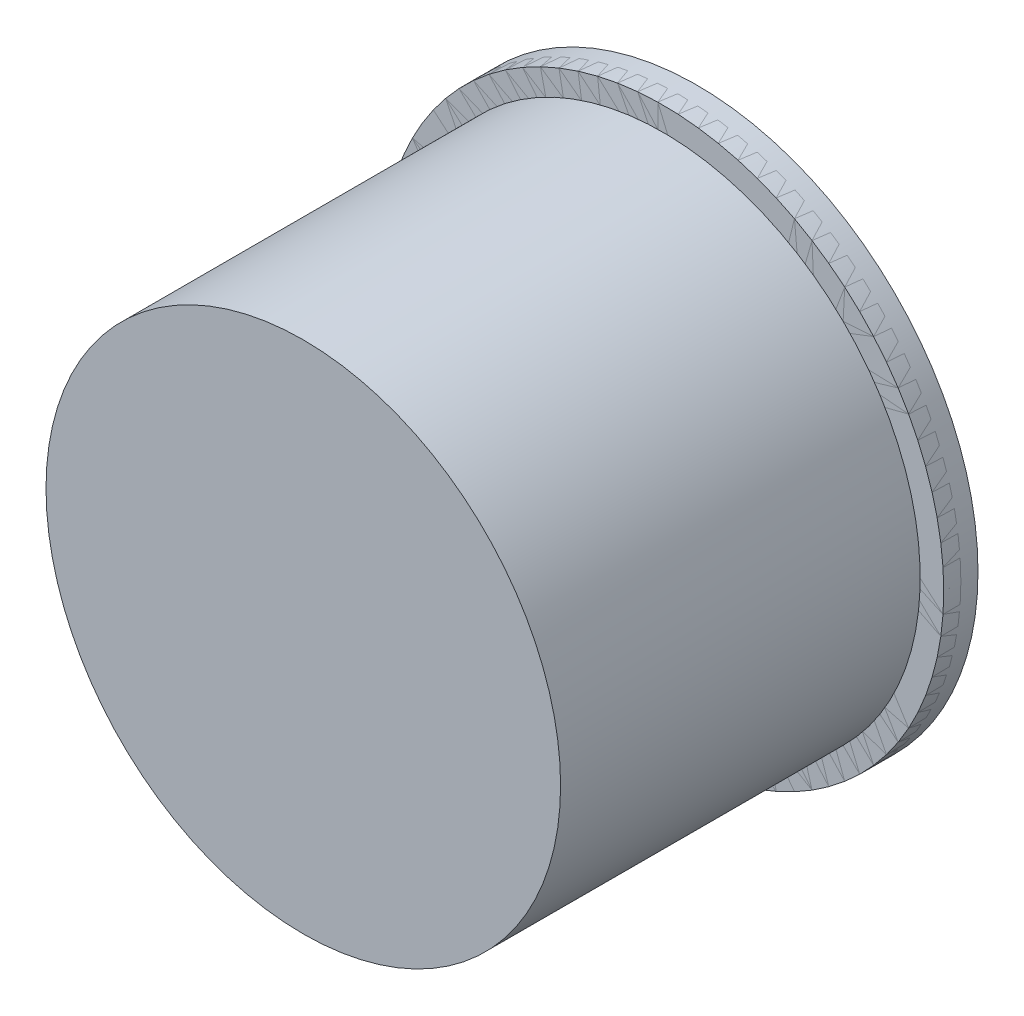
ISO-10303-21;
HEADER;
FILE_DESCRIPTION(('STEP AP214'),'2;1');
FILE_NAME('part.step','',(''),(''),'','','');
FILE_SCHEMA(('AUTOMOTIVE_DESIGN { 1 0 10303 214 1 1 1 1 }'));
ENDSEC;
DATA;
#1=APPLICATION_CONTEXT('core data for automotive mechanical design processes');
#2=APPLICATION_PROTOCOL_DEFINITION('international standard','automotive_design',2000,#1);
#3=PRODUCT_CONTEXT('',#1,'mechanical');
#4=PRODUCT('Part','Part','',(#3));
#5=PRODUCT_RELATED_PRODUCT_CATEGORY('part','',(#4));
#6=PRODUCT_DEFINITION_FORMATION('','',#4);
#7=PRODUCT_DEFINITION_CONTEXT('part definition',#1,'design');
#8=PRODUCT_DEFINITION('design','',#6,#7);
#9=PRODUCT_DEFINITION_SHAPE('','',#8);
#10=(LENGTH_UNIT() NAMED_UNIT(*) SI_UNIT(.MILLI.,.METRE.));
#11=(NAMED_UNIT(*) PLANE_ANGLE_UNIT() SI_UNIT($,.RADIAN.));
#12=(NAMED_UNIT(*) SI_UNIT($,.STERADIAN.) SOLID_ANGLE_UNIT());
#13=UNCERTAINTY_MEASURE_WITH_UNIT(LENGTH_MEASURE(1.E-05),#10,'distance_accuracy_value','');
#14=(GEOMETRIC_REPRESENTATION_CONTEXT(3) GLOBAL_UNCERTAINTY_ASSIGNED_CONTEXT((#13)) GLOBAL_UNIT_ASSIGNED_CONTEXT((#10,
#11,#12)) REPRESENTATION_CONTEXT('',''));
#15=CARTESIAN_POINT('',(0.,0.,0.));
#16=DIRECTION('',(0.,0.,1.));
#17=DIRECTION('',(1.,0.,0.));
#18=AXIS2_PLACEMENT_3D('',#15,#16,#17);
#19=CARTESIAN_POINT('',(0.,0.,16.5));
#20=DIRECTION('',(0.,0.,-1.));
#21=DIRECTION('',(-1.,0.,0.));
#22=AXIS2_PLACEMENT_3D('',#19,#20,#21);
#23=CYLINDRICAL_SURFACE('',#22,15.025);
#24=CARTESIAN_POINT('',(0.,0.,-6.5));
#25=DIRECTION('',(0.,0.,-1.));
#26=DIRECTION('',(-1.,0.,0.));
#27=AXIS2_PLACEMENT_3D('',#24,#25,#26);
#28=CIRCLE('',#27,15.025);
#29=CARTESIAN_POINT('',(-15.025,0.,-6.5));
#30=VERTEX_POINT('',#29);
#31=EDGE_CURVE('P0_E11',#30,#30,#28,.F.);
#32=ORIENTED_EDGE('',*,*,#31,.T.);
#33=EDGE_LOOP('',(#32));
#34=FACE_BOUND('',#33,.T.);
#35=CARTESIAN_POINT('',(0.,0.,14.5));
#36=DIRECTION('',(0.,0.,1.));
#37=DIRECTION('',(1.,0.,0.));
#38=AXIS2_PLACEMENT_3D('',#35,#36,#37);
#39=CIRCLE('',#38,15.025);
#40=CARTESIAN_POINT('',(15.025,0.,14.5));
#41=VERTEX_POINT('',#40);
#42=EDGE_CURVE('P0_E80',#41,#41,#39,.T.);
#43=ORIENTED_EDGE('',*,*,#42,.F.);
#44=EDGE_LOOP('',(#43));
#45=FACE_BOUND('',#44,.T.);
#46=ADVANCED_FACE('P0_F46',(#34,#45),#23,.T.);
#47=CARTESIAN_POINT('',(0.,0.,-8.5));
#48=DIRECTION('',(0.,0.,1.));
#49=DIRECTION('',(1.,0.,0.));
#50=AXIS2_PLACEMENT_3D('',#47,#48,#49);
#51=CYLINDRICAL_SURFACE('',#50,16.4);
#52=CARTESIAN_POINT('',(0.,0.,-6.5));
#53=DIRECTION('',(0.,0.,-1.));
#54=DIRECTION('',(1.,0.,0.));
#55=AXIS2_PLACEMENT_3D('',#52,#53,#54);
#56=CIRCLE('',#55,16.4);
#57=CARTESIAN_POINT('',(16.4,0.,-6.5));
#58=VERTEX_POINT('',#57);
#59=EDGE_CURVE('P0_E62',#58,#58,#56,.T.);
#60=ORIENTED_EDGE('',*,*,#59,.T.);
#61=EDGE_LOOP('',(#60));
#62=FACE_BOUND('',#61,.T.);
#63=CARTESIAN_POINT('',(0.,0.,-7.5));
#64=DIRECTION('',(0.,0.,-1.));
#65=DIRECTION('',(-1.,0.,0.));
#66=AXIS2_PLACEMENT_3D('',#63,#64,#65);
#67=CIRCLE('',#66,16.4);
#68=CARTESIAN_POINT('',(-16.4,0.,-7.5));
#69=VERTEX_POINT('',#68);
#70=EDGE_CURVE('P0_E67',#69,#69,#67,.T.);
#71=ORIENTED_EDGE('',*,*,#70,.F.);
#72=EDGE_LOOP('',(#71));
#73=FACE_BOUND('',#72,.T.);
#74=ADVANCED_FACE('P0_F63',(#62,#73),#51,.T.);
#75=CARTESIAN_POINT('',(0.,0.,-6.5));
#76=DIRECTION('',(0.,0.,-1.));
#77=DIRECTION('',(0.,-1.,0.));
#78=AXIS2_PLACEMENT_3D('',#75,#76,#77);
#79=PLANE('',#78);
#80=ORIENTED_EDGE('',*,*,#31,.F.);
#81=EDGE_LOOP('',(#80));
#82=FACE_BOUND('',#81,.T.);
#83=ORIENTED_EDGE('',*,*,#59,.F.);
#84=EDGE_LOOP('',(#83));
#85=FACE_BOUND('',#84,.T.);
#86=ADVANCED_FACE('P0_F48',(#82,#85),#79,.F.);
#87=CARTESIAN_POINT('',(0.,0.,-7.5));
#88=DIRECTION('',(0.,0.,-1.));
#89=DIRECTION('',(-1.,0.,0.));
#90=AXIS2_PLACEMENT_3D('',#87,#88,#89);
#91=PLANE('',#90);
#92=CARTESIAN_POINT('',(0.,0.,-7.5));
#93=DIRECTION('',(0.,0.,-1.));
#94=DIRECTION('',(-1.,0.,0.));
#95=AXIS2_PLACEMENT_3D('',#92,#93,#94);
#96=CIRCLE('',#95,6.05);
#97=CARTESIAN_POINT('',(-6.05,0.,-7.5));
#98=VERTEX_POINT('',#97);
#99=EDGE_CURVE('P0_E54',#98,#98,#96,.T.);
#100=ORIENTED_EDGE('',*,*,#99,.F.);
#101=EDGE_LOOP('',(#100));
#102=FACE_BOUND('',#101,.T.);
#103=ORIENTED_EDGE('',*,*,#70,.T.);
#104=EDGE_LOOP('',(#103));
#105=FACE_BOUND('',#104,.T.);
#106=ADVANCED_FACE('P0_F102',(#102,#105),#91,.T.);
#107=CARTESIAN_POINT('',(0.,0.,-13.));
#108=DIRECTION('',(0.,0.,1.));
#109=DIRECTION('',(1.,0.,0.));
#110=AXIS2_PLACEMENT_3D('',#107,#108,#109);
#111=CYLINDRICAL_SURFACE('',#110,6.05);
#112=CARTESIAN_POINT('',(0.,0.,-13.));
#113=DIRECTION('',(0.,0.,-1.));
#114=DIRECTION('',(-1.,0.,0.));
#115=AXIS2_PLACEMENT_3D('',#112,#113,#114);
#116=CIRCLE('',#115,6.05);
#117=CARTESIAN_POINT('',(-6.05,0.,-13.));
#118=VERTEX_POINT('',#117);
#119=EDGE_CURVE('P0_E74',#118,#118,#116,.T.);
#120=ORIENTED_EDGE('',*,*,#119,.F.);
#121=EDGE_LOOP('',(#120));
#122=FACE_BOUND('',#121,.T.);
#123=ORIENTED_EDGE('',*,*,#99,.T.);
#124=EDGE_LOOP('',(#123));
#125=FACE_BOUND('',#124,.T.);
#126=ADVANCED_FACE('P0_F98',(#122,#125),#111,.T.);
#127=CARTESIAN_POINT('',(0.,0.,-13.));
#128=DIRECTION('',(0.,0.,-1.));
#129=DIRECTION('',(-1.,0.,0.));
#130=AXIS2_PLACEMENT_3D('',#127,#128,#129);
#131=PLANE('',#130);
#132=ORIENTED_EDGE('',*,*,#119,.T.);
#133=EDGE_LOOP('',(#132));
#134=FACE_BOUND('',#133,.T.);
#135=ADVANCED_FACE('P0_F95',(#134),#131,.T.);
#136=CARTESIAN_POINT('',(0.,0.,14.5));
#137=DIRECTION('',(0.,0.,1.));
#138=DIRECTION('',(1.,0.,0.));
#139=AXIS2_PLACEMENT_3D('',#136,#137,#138);
#140=PLANE('',#139);
#141=ORIENTED_EDGE('',*,*,#42,.T.);
#142=EDGE_LOOP('',(#141));
#143=FACE_BOUND('',#142,.T.);
#144=ADVANCED_FACE('P0_F85',(#143),#140,.T.);
#145=CLOSED_SHELL('',(#46,#74,#86,#106,#126,#135,#144));
#146=MANIFOLD_SOLID_BREP('P0_B2',#145);
#147=CARTESIAN_POINT('',(0.,13.5,8.5));
#148=DIRECTION('',(0.,0.,1.));
#149=DIRECTION('',(1.,0.,0.));
#150=AXIS2_PLACEMENT_3D('',#147,#148,#149);
#151=CONICAL_SURFACE('',#150,1.25,0.785398162500002);
#152=CARTESIAN_POINT('',(0.,13.5,8.5));
#153=DIRECTION('',(0.,0.,-1.));
#154=DIRECTION('',(1.,0.,0.));
#155=AXIS2_PLACEMENT_3D('',#152,#153,#154);
#156=CIRCLE('',#155,1.25);
#157=CARTESIAN_POINT('',(1.25000000000005,13.5,8.5));
#158=VERTEX_POINT('',#157);
#159=EDGE_CURVE('P1_E19',#158,#158,#156,.T.);
#160=ORIENTED_EDGE('',*,*,#159,.F.);
#161=EDGE_LOOP('',(#160));
#162=FACE_BOUND('',#161,.T.);
#163=CARTESIAN_POINT('',(0.,13.5,8.275));
#164=DIRECTION('',(0.,0.,1.));
#165=DIRECTION('',(1.,0.,0.));
#166=AXIS2_PLACEMENT_3D('',#163,#164,#165);
#167=CIRCLE('',#166,1.025);
#168=CARTESIAN_POINT('',(1.02500000000005,13.5,8.275));
#169=VERTEX_POINT('',#168);
#170=EDGE_CURVE('P1_E10',#169,#169,#167,.T.);
#171=ORIENTED_EDGE('',*,*,#170,.F.);
#172=EDGE_LOOP('',(#171));
#173=FACE_BOUND('',#172,.T.);
#174=ADVANCED_FACE('P1_F15',(#162,#173),#151,.F.);
#175=CARTESIAN_POINT('',(0.,13.5,8.5));
#176=DIRECTION('',(0.,0.,-1.));
#177=DIRECTION('',(-1.,0.,0.));
#178=AXIS2_PLACEMENT_3D('',#175,#176,#177);
#179=CYLINDRICAL_SURFACE('',#178,1.025);
#180=CARTESIAN_POINT('',(0.,13.5,3.5));
#181=DIRECTION('',(0.,0.,1.));
#182=DIRECTION('',(-1.,0.,0.));
#183=AXIS2_PLACEMENT_3D('',#180,#181,#182);
#184=CIRCLE('',#183,1.025);
#185=CARTESIAN_POINT('',(-1.02499999999995,13.5,3.5));
#186=VERTEX_POINT('',#185);
#187=EDGE_CURVE('P1_E26',#186,#186,#184,.T.);
#188=ORIENTED_EDGE('',*,*,#187,.F.);
#189=EDGE_LOOP('',(#188));
#190=FACE_BOUND('',#189,.T.);
#191=ORIENTED_EDGE('',*,*,#170,.T.);
#192=EDGE_LOOP('',(#191));
#193=FACE_BOUND('',#192,.T.);
#194=ADVANCED_FACE('P1_F211',(#190,#193),#179,.F.);
#195=CARTESIAN_POINT('',(0.,13.5,3.5));
#196=DIRECTION('',(0.,0.,1.));
#197=DIRECTION('',(1.,0.,0.));
#198=AXIS2_PLACEMENT_3D('',#195,#196,#197);
#199=CONICAL_SURFACE('',#198,1.025,1.0297442575);
#200=CARTESIAN_POINT('',(0.,13.5,2.88411786549675));
#201=VERTEX_POINT('',#200);
#202=VERTEX_LOOP('',#201);
#203=FACE_BOUND('',#202,.T.);
#204=ORIENTED_EDGE('',*,*,#187,.T.);
#205=EDGE_LOOP('',(#204));
#206=FACE_BOUND('',#205,.T.);
#207=ADVANCED_FACE('P1_F217',(#203,#206),#199,.F.);
#208=CARTESIAN_POINT('',(13.5,0.,8.5));
#209=DIRECTION('',(0.,0.,1.));
#210=DIRECTION('',(1.,0.,0.));
#211=AXIS2_PLACEMENT_3D('',#208,#209,#210);
#212=CONICAL_SURFACE('',#211,1.25,0.7853981625);
#213=CARTESIAN_POINT('',(13.5,0.,8.5));
#214=DIRECTION('',(0.,0.,-1.));
#215=DIRECTION('',(1.,0.,0.));
#216=AXIS2_PLACEMENT_3D('',#213,#214,#215);
#217=CIRCLE('',#216,1.25);
#218=CARTESIAN_POINT('',(14.75,0.,8.5));
#219=VERTEX_POINT('',#218);
#220=EDGE_CURVE('P1_E166',#219,#219,#217,.T.);
#221=ORIENTED_EDGE('',*,*,#220,.F.);
#222=EDGE_LOOP('',(#221));
#223=FACE_BOUND('',#222,.T.);
#224=CARTESIAN_POINT('',(13.5,0.,8.275));
#225=DIRECTION('',(0.,0.,1.));
#226=DIRECTION('',(1.,0.,0.));
#227=AXIS2_PLACEMENT_3D('',#224,#225,#226);
#228=CIRCLE('',#227,1.025);
#229=CARTESIAN_POINT('',(14.525,0.,8.275));
#230=VERTEX_POINT('',#229);
#231=EDGE_CURVE('P1_E120',#230,#230,#228,.T.);
#232=ORIENTED_EDGE('',*,*,#231,.F.);
#233=EDGE_LOOP('',(#232));
#234=FACE_BOUND('',#233,.T.);
#235=ADVANCED_FACE('P1_F222',(#223,#234),#212,.F.);
#236=CARTESIAN_POINT('',(13.5,0.,8.5));
#237=DIRECTION('',(0.,0.,-1.));
#238=DIRECTION('',(-1.,0.,0.));
#239=AXIS2_PLACEMENT_3D('',#236,#237,#238);
#240=CYLINDRICAL_SURFACE('',#239,1.025);
#241=CARTESIAN_POINT('',(13.5,0.,3.5));
#242=DIRECTION('',(0.,0.,1.));
#243=DIRECTION('',(-1.,0.,0.));
#244=AXIS2_PLACEMENT_3D('',#241,#242,#243);
#245=CIRCLE('',#244,1.025);
#246=CARTESIAN_POINT('',(12.475,0.,3.5));
#247=VERTEX_POINT('',#246);
#248=EDGE_CURVE('P1_E124',#247,#247,#245,.T.);
#249=ORIENTED_EDGE('',*,*,#248,.F.);
#250=EDGE_LOOP('',(#249));
#251=FACE_BOUND('',#250,.T.);
#252=ORIENTED_EDGE('',*,*,#231,.T.);
#253=EDGE_LOOP('',(#252));
#254=FACE_BOUND('',#253,.T.);
#255=ADVANCED_FACE('P1_F121',(#251,#254),#240,.F.);
#256=CARTESIAN_POINT('',(13.5,0.,3.5));
#257=DIRECTION('',(0.,0.,1.));
#258=DIRECTION('',(1.,0.,0.));
#259=AXIS2_PLACEMENT_3D('',#256,#257,#258);
#260=CONICAL_SURFACE('',#259,1.025,1.0297442575);
#261=CARTESIAN_POINT('',(13.5,0.,2.88411786549675));
#262=VERTEX_POINT('',#261);
#263=VERTEX_LOOP('',#262);
#264=FACE_BOUND('',#263,.T.);
#265=ORIENTED_EDGE('',*,*,#248,.T.);
#266=EDGE_LOOP('',(#265));
#267=FACE_BOUND('',#266,.T.);
#268=ADVANCED_FACE('P1_F17',(#264,#267),#260,.F.);
#269=CARTESIAN_POINT('',(0.,-13.5,8.5));
#270=DIRECTION('',(0.,0.,1.));
#271=DIRECTION('',(1.,0.,0.));
#272=AXIS2_PLACEMENT_3D('',#269,#270,#271);
#273=CONICAL_SURFACE('',#272,1.25,0.785398162500002);
#274=CARTESIAN_POINT('',(0.,-13.5,8.5));
#275=DIRECTION('',(0.,0.,-1.));
#276=DIRECTION('',(1.,0.,0.));
#277=AXIS2_PLACEMENT_3D('',#274,#275,#276);
#278=CIRCLE('',#277,1.25);
#279=CARTESIAN_POINT('',(1.24999999999998,-13.5,8.5));
#280=VERTEX_POINT('',#279);
#281=EDGE_CURVE('P1_E164',#280,#280,#278,.T.);
#282=ORIENTED_EDGE('',*,*,#281,.F.);
#283=EDGE_LOOP('',(#282));
#284=FACE_BOUND('',#283,.T.);
#285=CARTESIAN_POINT('',(0.,-13.5,8.275));
#286=DIRECTION('',(0.,0.,1.));
#287=DIRECTION('',(1.,0.,0.));
#288=AXIS2_PLACEMENT_3D('',#285,#286,#287);
#289=CIRCLE('',#288,1.025);
#290=CARTESIAN_POINT('',(1.02499999999998,-13.5,8.275));
#291=VERTEX_POINT('',#290);
#292=EDGE_CURVE('P1_E132',#291,#291,#289,.T.);
#293=ORIENTED_EDGE('',*,*,#292,.F.);
#294=EDGE_LOOP('',(#293));
#295=FACE_BOUND('',#294,.T.);
#296=ADVANCED_FACE('P1_F240',(#284,#295),#273,.F.);
#297=CARTESIAN_POINT('',(0.,-13.5,8.5));
#298=DIRECTION('',(0.,0.,-1.));
#299=DIRECTION('',(-1.,0.,0.));
#300=AXIS2_PLACEMENT_3D('',#297,#298,#299);
#301=CYLINDRICAL_SURFACE('',#300,1.025);
#302=CARTESIAN_POINT('',(0.,-13.5,3.5));
#303=DIRECTION('',(0.,0.,1.));
#304=DIRECTION('',(-1.,0.,0.));
#305=AXIS2_PLACEMENT_3D('',#302,#303,#304);
#306=CIRCLE('',#305,1.025);
#307=CARTESIAN_POINT('',(-1.02500000000002,-13.5,3.5));
#308=VERTEX_POINT('',#307);
#309=EDGE_CURVE('P1_E160',#308,#308,#306,.T.);
#310=ORIENTED_EDGE('',*,*,#309,.F.);
#311=EDGE_LOOP('',(#310));
#312=FACE_BOUND('',#311,.T.);
#313=ORIENTED_EDGE('',*,*,#292,.T.);
#314=EDGE_LOOP('',(#313));
#315=FACE_BOUND('',#314,.T.);
#316=ADVANCED_FACE('P1_F236',(#312,#315),#301,.F.);
#317=CARTESIAN_POINT('',(0.,-13.5,3.5));
#318=DIRECTION('',(0.,0.,1.));
#319=DIRECTION('',(1.,0.,0.));
#320=AXIS2_PLACEMENT_3D('',#317,#318,#319);
#321=CONICAL_SURFACE('',#320,1.025,1.0297442575);
#322=CARTESIAN_POINT('',(0.,-13.5,2.88411786549675));
#323=VERTEX_POINT('',#322);
#324=VERTEX_LOOP('',#323);
#325=FACE_BOUND('',#324,.T.);
#326=ORIENTED_EDGE('',*,*,#309,.T.);
#327=EDGE_LOOP('',(#326));
#328=FACE_BOUND('',#327,.T.);
#329=ADVANCED_FACE('P1_F239',(#325,#328),#321,.F.);
#330=CARTESIAN_POINT('',(-13.5,0.,8.5));
#331=DIRECTION('',(0.,0.,1.));
#332=DIRECTION('',(1.,0.,0.));
#333=AXIS2_PLACEMENT_3D('',#330,#331,#332);
#334=CONICAL_SURFACE('',#333,1.25,0.7853981625);
#335=CARTESIAN_POINT('',(-13.5,0.,8.5));
#336=DIRECTION('',(0.,0.,-1.));
#337=DIRECTION('',(1.,0.,0.));
#338=AXIS2_PLACEMENT_3D('',#335,#336,#337);
#339=CIRCLE('',#338,1.25);
#340=CARTESIAN_POINT('',(-12.25,0.,8.5));
#341=VERTEX_POINT('',#340);
#342=EDGE_CURVE('P1_E156',#341,#341,#339,.T.);
#343=ORIENTED_EDGE('',*,*,#342,.F.);
#344=EDGE_LOOP('',(#343));
#345=FACE_BOUND('',#344,.T.);
#346=CARTESIAN_POINT('',(-13.5,0.,8.275));
#347=DIRECTION('',(0.,0.,1.));
#348=DIRECTION('',(1.,0.,0.));
#349=AXIS2_PLACEMENT_3D('',#346,#347,#348);
#350=CIRCLE('',#349,1.025);
#351=CARTESIAN_POINT('',(-12.475,0.,8.275));
#352=VERTEX_POINT('',#351);
#353=EDGE_CURVE('P1_E161',#352,#352,#350,.T.);
#354=ORIENTED_EDGE('',*,*,#353,.F.);
#355=EDGE_LOOP('',(#354));
#356=FACE_BOUND('',#355,.T.);
#357=ADVANCED_FACE('P1_F321',(#345,#356),#334,.F.);
#358=CARTESIAN_POINT('',(-13.5,0.,8.5));
#359=DIRECTION('',(0.,0.,-1.));
#360=DIRECTION('',(-1.,0.,0.));
#361=AXIS2_PLACEMENT_3D('',#358,#359,#360);
#362=CYLINDRICAL_SURFACE('',#361,1.025);
#363=CARTESIAN_POINT('',(-13.5,0.,3.5));
#364=DIRECTION('',(0.,0.,1.));
#365=DIRECTION('',(-1.,0.,0.));
#366=AXIS2_PLACEMENT_3D('',#363,#364,#365);
#367=CIRCLE('',#366,1.025);
#368=CARTESIAN_POINT('',(-14.525,0.,3.5));
#369=VERTEX_POINT('',#368);
#370=EDGE_CURVE('P1_E163',#369,#369,#367,.T.);
#371=ORIENTED_EDGE('',*,*,#370,.F.);
#372=EDGE_LOOP('',(#371));
#373=FACE_BOUND('',#372,.T.);
#374=ORIENTED_EDGE('',*,*,#353,.T.);
#375=EDGE_LOOP('',(#374));
#376=FACE_BOUND('',#375,.T.);
#377=ADVANCED_FACE('P1_F329',(#373,#376),#362,.F.);
#378=CARTESIAN_POINT('',(-13.5,0.,3.5));
#379=DIRECTION('',(0.,0.,1.));
#380=DIRECTION('',(1.,0.,0.));
#381=AXIS2_PLACEMENT_3D('',#378,#379,#380);
#382=CONICAL_SURFACE('',#381,1.025,1.0297442575);
#383=CARTESIAN_POINT('',(-13.5,0.,2.88411786549675));
#384=VERTEX_POINT('',#383);
#385=VERTEX_LOOP('',#384);
#386=FACE_BOUND('',#385,.T.);
#387=ORIENTED_EDGE('',*,*,#370,.T.);
#388=EDGE_LOOP('',(#387));
#389=FACE_BOUND('',#388,.T.);
#390=ADVANCED_FACE('P1_F261',(#386,#389),#382,.F.);
#391=CARTESIAN_POINT('',(0.,0.,-2.5));
#392=DIRECTION('',(0.,0.,-1.));
#393=DIRECTION('',(-1.,0.,0.));
#394=AXIS2_PLACEMENT_3D('',#391,#392,#393);
#395=CYLINDRICAL_SURFACE('',#394,12.);
#396=CARTESIAN_POINT('',(0.,0.,-8.5));
#397=DIRECTION('',(0.,0.,-1.));
#398=DIRECTION('',(1.,0.,0.));
#399=AXIS2_PLACEMENT_3D('',#396,#397,#398);
#400=CIRCLE('',#399,12.);
#401=CARTESIAN_POINT('',(12.,0.,-8.5));
#402=VERTEX_POINT('',#401);
#403=EDGE_CURVE('P1_E138',#402,#402,#400,.T.);
#404=ORIENTED_EDGE('',*,*,#403,.T.);
#405=EDGE_LOOP('',(#404));
#406=FACE_BOUND('',#405,.T.);
#407=CARTESIAN_POINT('',(0.,0.,-2.5));
#408=DIRECTION('',(0.,0.,1.));
#409=DIRECTION('',(1.,0.,0.));
#410=AXIS2_PLACEMENT_3D('',#407,#408,#409);
#411=CIRCLE('',#410,12.);
#412=CARTESIAN_POINT('',(12.,0.,-2.5));
#413=VERTEX_POINT('',#412);
#414=EDGE_CURVE('P1_E264',#413,#413,#411,.T.);
#415=ORIENTED_EDGE('',*,*,#414,.T.);
#416=EDGE_LOOP('',(#415));
#417=FACE_BOUND('',#416,.T.);
#418=ADVANCED_FACE('P1_F258',(#406,#417),#395,.F.);
#419=CARTESIAN_POINT('',(0.,0.,-2.5));
#420=DIRECTION('',(0.,0.,-1.));
#421=DIRECTION('',(0.,-1.,0.));
#422=AXIS2_PLACEMENT_3D('',#419,#420,#421);
#423=PLANE('',#422);
#424=CARTESIAN_POINT('',(0.,0.,-2.5));
#425=DIRECTION('',(0.,0.,1.));
#426=DIRECTION('',(-1.,0.,0.));
#427=AXIS2_PLACEMENT_3D('',#424,#425,#426);
#428=CIRCLE('',#427,11.);
#429=CARTESIAN_POINT('',(-11.,0.,-2.5));
#430=VERTEX_POINT('',#429);
#431=EDGE_CURVE('P1_E176',#430,#430,#428,.T.);
#432=ORIENTED_EDGE('',*,*,#431,.T.);
#433=EDGE_LOOP('',(#432));
#434=FACE_BOUND('',#433,.T.);
#435=ORIENTED_EDGE('',*,*,#414,.F.);
#436=EDGE_LOOP('',(#435));
#437=FACE_BOUND('',#436,.T.);
#438=ADVANCED_FACE('P1_F231',(#434,#437),#423,.T.);
#439=CARTESIAN_POINT('',(0.,0.,2.5));
#440=DIRECTION('',(0.,0.,1.));
#441=DIRECTION('',(1.,0.,0.));
#442=AXIS2_PLACEMENT_3D('',#439,#440,#441);
#443=CYLINDRICAL_SURFACE('',#442,12.);
#444=CARTESIAN_POINT('',(0.,0.,8.5));
#445=DIRECTION('',(0.,0.,1.));
#446=DIRECTION('',(1.,0.,0.));
#447=AXIS2_PLACEMENT_3D('',#444,#445,#446);
#448=CIRCLE('',#447,12.);
#449=CARTESIAN_POINT('',(12.,0.,8.5));
#450=VERTEX_POINT('',#449);
#451=EDGE_CURVE('P1_E148',#450,#450,#448,.T.);
#452=ORIENTED_EDGE('',*,*,#451,.T.);
#453=EDGE_LOOP('',(#452));
#454=FACE_BOUND('',#453,.T.);
#455=CARTESIAN_POINT('',(0.,0.,2.5));
#456=DIRECTION('',(0.,0.,-1.));
#457=DIRECTION('',(1.,0.,0.));
#458=AXIS2_PLACEMENT_3D('',#455,#456,#457);
#459=CIRCLE('',#458,12.);
#460=CARTESIAN_POINT('',(12.,0.,2.5));
#461=VERTEX_POINT('',#460);
#462=EDGE_CURVE('P1_E145',#461,#461,#459,.T.);
#463=ORIENTED_EDGE('',*,*,#462,.T.);
#464=EDGE_LOOP('',(#463));
#465=FACE_BOUND('',#464,.T.);
#466=ADVANCED_FACE('P1_F228',(#454,#465),#443,.F.);
#467=CARTESIAN_POINT('',(0.,0.,2.5));
#468=DIRECTION('',(0.,0.,1.));
#469=DIRECTION('',(1.,0.,0.));
#470=AXIS2_PLACEMENT_3D('',#467,#468,#469);
#471=PLANE('',#470);
#472=CARTESIAN_POINT('',(0.,0.,2.5));
#473=DIRECTION('',(0.,0.,-1.));
#474=DIRECTION('',(1.,0.,0.));
#475=AXIS2_PLACEMENT_3D('',#472,#473,#474);
#476=CIRCLE('',#475,11.);
#477=CARTESIAN_POINT('',(11.,0.,2.5));
#478=VERTEX_POINT('',#477);
#479=EDGE_CURVE('P1_E182',#478,#478,#476,.T.);
#480=ORIENTED_EDGE('',*,*,#479,.T.);
#481=EDGE_LOOP('',(#480));
#482=FACE_BOUND('',#481,.T.);
#483=ORIENTED_EDGE('',*,*,#462,.F.);
#484=EDGE_LOOP('',(#483));
#485=FACE_BOUND('',#484,.T.);
#486=ADVANCED_FACE('P1_F192',(#482,#485),#471,.T.);
#487=CARTESIAN_POINT('',(0.,0.,-6.5));
#488=DIRECTION('',(0.,0.,-1.));
#489=DIRECTION('',(0.,-1.,0.));
#490=AXIS2_PLACEMENT_3D('',#487,#488,#489);
#491=PLANE('',#490);
#492=CARTESIAN_POINT('',(0.,0.,-6.5));
#493=DIRECTION('',(0.,0.,-1.));
#494=DIRECTION('',(1.,0.,0.));
#495=AXIS2_PLACEMENT_3D('',#492,#493,#494);
#496=CIRCLE('',#495,16.4);
#497=CARTESIAN_POINT('',(16.4,0.,-6.5));
#498=VERTEX_POINT('',#497);
#499=EDGE_CURVE('P1_E136',#498,#498,#496,.T.);
#500=ORIENTED_EDGE('',*,*,#499,.F.);
#501=EDGE_LOOP('',(#500));
#502=FACE_BOUND('',#501,.T.);
#503=CARTESIAN_POINT('',(0.,0.,-6.5));
#504=DIRECTION('',(0.,0.,1.));
#505=DIRECTION('',(1.,0.,0.));
#506=AXIS2_PLACEMENT_3D('',#503,#504,#505);
#507=CIRCLE('',#506,15.);
#508=CARTESIAN_POINT('',(15.,0.,-6.5));
#509=VERTEX_POINT('',#508);
#510=EDGE_CURVE('P1_E170',#509,#509,#507,.T.);
#511=ORIENTED_EDGE('',*,*,#510,.F.);
#512=EDGE_LOOP('',(#511));
#513=FACE_BOUND('',#512,.T.);
#514=ADVANCED_FACE('P1_F244',(#502,#513),#491,.F.);
#515=CARTESIAN_POINT('',(0.,0.,-8.5));
#516=DIRECTION('',(0.,0.,-1.));
#517=DIRECTION('',(0.,-1.,0.));
#518=AXIS2_PLACEMENT_3D('',#515,#516,#517);
#519=PLANE('',#518);
#520=CARTESIAN_POINT('',(0.,0.,-8.5));
#521=DIRECTION('',(0.,0.,-1.));
#522=DIRECTION('',(1.,0.,0.));
#523=AXIS2_PLACEMENT_3D('',#520,#521,#522);
#524=CIRCLE('',#523,16.4);
#525=CARTESIAN_POINT('',(16.4,0.,-8.5));
#526=VERTEX_POINT('',#525);
#527=EDGE_CURVE('P1_E139',#526,#526,#524,.T.);
#528=ORIENTED_EDGE('',*,*,#527,.T.);
#529=EDGE_LOOP('',(#528));
#530=FACE_BOUND('',#529,.T.);
#531=ORIENTED_EDGE('',*,*,#403,.F.);
#532=EDGE_LOOP('',(#531));
#533=FACE_BOUND('',#532,.T.);
#534=ADVANCED_FACE('P1_F245',(#530,#533),#519,.T.);
#535=CARTESIAN_POINT('',(0.,0.,-8.5));
#536=DIRECTION('',(0.,0.,1.));
#537=DIRECTION('',(1.,0.,0.));
#538=AXIS2_PLACEMENT_3D('',#535,#536,#537);
#539=CYLINDRICAL_SURFACE('',#538,16.4);
#540=ORIENTED_EDGE('',*,*,#499,.T.);
#541=EDGE_LOOP('',(#540));
#542=FACE_BOUND('',#541,.T.);
#543=ORIENTED_EDGE('',*,*,#527,.F.);
#544=EDGE_LOOP('',(#543));
#545=FACE_BOUND('',#544,.T.);
#546=ADVANCED_FACE('P1_F247',(#542,#545),#539,.T.);
#547=CARTESIAN_POINT('',(0.,0.,8.5));
#548=DIRECTION('',(0.,0.,1.));
#549=DIRECTION('',(1.,0.,0.));
#550=AXIS2_PLACEMENT_3D('',#547,#548,#549);
#551=PLANE('',#550);
#552=CARTESIAN_POINT('',(0.,0.,8.5));
#553=DIRECTION('',(0.,0.,1.));
#554=DIRECTION('',(1.,0.,0.));
#555=AXIS2_PLACEMENT_3D('',#552,#553,#554);
#556=CIRCLE('',#555,15.);
#557=CARTESIAN_POINT('',(15.,0.,8.5));
#558=VERTEX_POINT('',#557);
#559=EDGE_CURVE('P1_E167',#558,#558,#556,.T.);
#560=ORIENTED_EDGE('',*,*,#559,.T.);
#561=EDGE_LOOP('',(#560));
#562=FACE_BOUND('',#561,.T.);
#563=ORIENTED_EDGE('',*,*,#451,.F.);
#564=EDGE_LOOP('',(#563));
#565=FACE_BOUND('',#564,.T.);
#566=ORIENTED_EDGE('',*,*,#342,.T.);
#567=EDGE_LOOP('',(#566));
#568=FACE_BOUND('',#567,.T.);
#569=ORIENTED_EDGE('',*,*,#281,.T.);
#570=EDGE_LOOP('',(#569));
#571=FACE_BOUND('',#570,.T.);
#572=ORIENTED_EDGE('',*,*,#220,.T.);
#573=EDGE_LOOP('',(#572));
#574=FACE_BOUND('',#573,.T.);
#575=ORIENTED_EDGE('',*,*,#159,.T.);
#576=EDGE_LOOP('',(#575));
#577=FACE_BOUND('',#576,.T.);
#578=ADVANCED_FACE('P1_F204',(#562,#565,#568,#571,#574,#577),#551,.T.);
#579=CARTESIAN_POINT('',(0.,0.,-6.5));
#580=DIRECTION('',(0.,0.,1.));
#581=DIRECTION('',(1.,0.,0.));
#582=AXIS2_PLACEMENT_3D('',#579,#580,#581);
#583=CYLINDRICAL_SURFACE('',#582,15.);
#584=ORIENTED_EDGE('',*,*,#559,.F.);
#585=EDGE_LOOP('',(#584));
#586=FACE_BOUND('',#585,.T.);
#587=ORIENTED_EDGE('',*,*,#510,.T.);
#588=EDGE_LOOP('',(#587));
#589=FACE_BOUND('',#588,.T.);
#590=ADVANCED_FACE('P1_F197',(#586,#589),#583,.T.);
#591=CARTESIAN_POINT('',(0.,0.,-6.5));
#592=DIRECTION('',(0.,0.,1.));
#593=DIRECTION('',(1.,0.,0.));
#594=AXIS2_PLACEMENT_3D('',#591,#592,#593);
#595=CYLINDRICAL_SURFACE('',#594,11.);
#596=ORIENTED_EDGE('',*,*,#431,.F.);
#597=EDGE_LOOP('',(#596));
#598=FACE_BOUND('',#597,.T.);
#599=ORIENTED_EDGE('',*,*,#479,.F.);
#600=EDGE_LOOP('',(#599));
#601=FACE_BOUND('',#600,.T.);
#602=ADVANCED_FACE('P1_F195',(#598,#601),#595,.F.);
#603=CLOSED_SHELL('',(#174,#194,#207,#235,#255,#268,#296,#316,#329,#357,#377,#390,#418,#438,
#466,#486,#514,#534,#546,#578,#590,#602));
#604=MANIFOLD_SOLID_BREP('P1_B1',#603);
#605=ADVANCED_BREP_SHAPE_REPRESENTATION('',(#18,#146,#604),#14);
#606=SHAPE_DEFINITION_REPRESENTATION(#9,#605);
ENDSEC;
END-ISO-10303-21;
